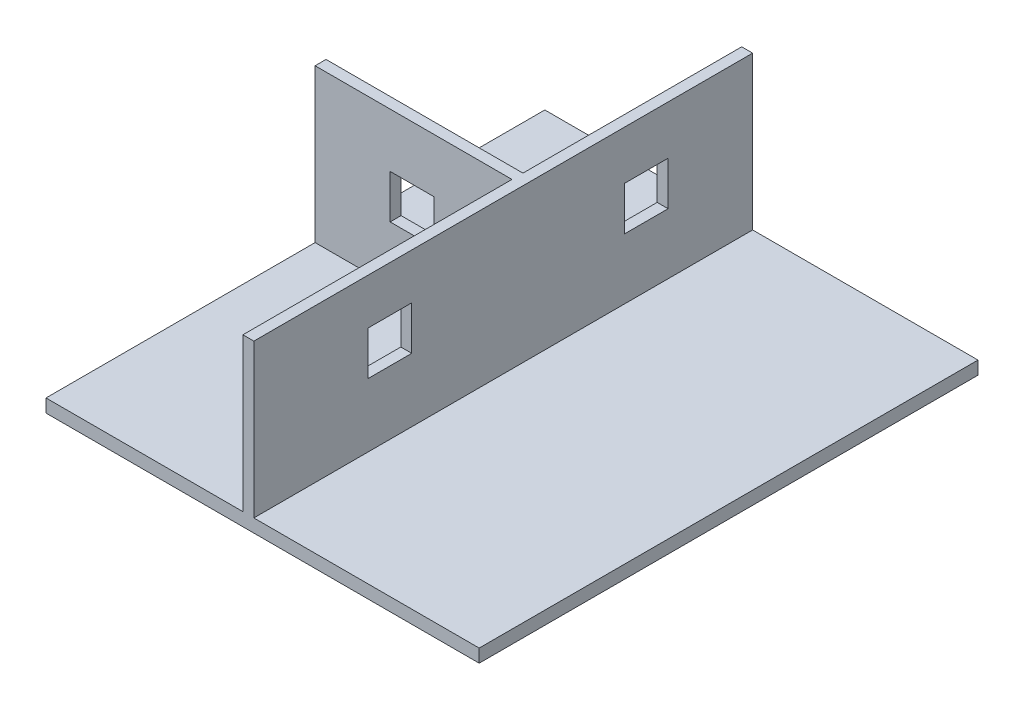
ISO-10303-21;
HEADER;
FILE_DESCRIPTION(('STEP AP214'),'2;1');
FILE_NAME('part.step','',(''),(''),'','','');
FILE_SCHEMA(('AUTOMOTIVE_DESIGN { 1 0 10303 214 1 1 1 1 }'));
ENDSEC;
DATA;
#1=APPLICATION_CONTEXT('core data for automotive mechanical design processes');
#2=APPLICATION_PROTOCOL_DEFINITION('international standard','automotive_design',2000,#1);
#3=PRODUCT_CONTEXT('',#1,'mechanical');
#4=PRODUCT('Part','Part','',(#3));
#5=PRODUCT_RELATED_PRODUCT_CATEGORY('part','',(#4));
#6=PRODUCT_DEFINITION_FORMATION('','',#4);
#7=PRODUCT_DEFINITION_CONTEXT('part definition',#1,'design');
#8=PRODUCT_DEFINITION('design','',#6,#7);
#9=PRODUCT_DEFINITION_SHAPE('','',#8);
#10=(LENGTH_UNIT() NAMED_UNIT(*) SI_UNIT(.MILLI.,.METRE.));
#11=(NAMED_UNIT(*) PLANE_ANGLE_UNIT() SI_UNIT($,.RADIAN.));
#12=(NAMED_UNIT(*) SI_UNIT($,.STERADIAN.) SOLID_ANGLE_UNIT());
#13=UNCERTAINTY_MEASURE_WITH_UNIT(LENGTH_MEASURE(1.E-05),#10,'distance_accuracy_value','');
#14=(GEOMETRIC_REPRESENTATION_CONTEXT(3) GLOBAL_UNCERTAINTY_ASSIGNED_CONTEXT((#13)) GLOBAL_UNIT_ASSIGNED_CONTEXT((#10,
#11,#12)) REPRESENTATION_CONTEXT('',''));
#15=CARTESIAN_POINT('',(0.,0.,0.));
#16=DIRECTION('',(0.,0.,1.));
#17=DIRECTION('',(1.,0.,0.));
#18=AXIS2_PLACEMENT_3D('',#15,#16,#17);
#19=CARTESIAN_POINT('',(0.,3.,0.));
#20=DIRECTION('',(0.,1.,0.));
#21=DIRECTION('',(0.,0.,1.));
#22=AXIS2_PLACEMENT_3D('',#19,#20,#21);
#23=PLANE('',#22);
#24=DIRECTION('',(0.,0.,-1.));
#25=VECTOR('',#24,1.);
#26=CARTESIAN_POINT('',(-2.00000000000002,3.,-57.));
#27=LINE('',#26,#25);
#28=CARTESIAN_POINT('',(-2.00000000000001,3.,57.));
#29=VERTEX_POINT('',#28);
#30=CARTESIAN_POINT('',(-2.00000000000001,3.,-57.));
#31=VERTEX_POINT('',#30);
#32=EDGE_CURVE('E297',#29,#31,#27,.T.);
#33=ORIENTED_EDGE('',*,*,#32,.F.);
#34=DIRECTION('',(1.,0.,0.));
#35=VECTOR('',#34,1.);
#36=CARTESIAN_POINT('',(-49.5,3.,57.));
#37=LINE('',#36,#35);
#38=CARTESIAN_POINT('',(49.5,3.,57.));
#39=VERTEX_POINT('',#38);
#40=EDGE_CURVE('E364',#29,#39,#37,.T.);
#41=ORIENTED_EDGE('',*,*,#40,.T.);
#42=DIRECTION('',(0.,0.,-1.));
#43=VECTOR('',#42,1.);
#44=CARTESIAN_POINT('',(49.5,3.,-57.));
#45=LINE('',#44,#43);
#46=CARTESIAN_POINT('',(49.5,3.,-57.));
#47=VERTEX_POINT('',#46);
#48=EDGE_CURVE('E354',#39,#47,#45,.T.);
#49=ORIENTED_EDGE('',*,*,#48,.T.);
#50=DIRECTION('',(-1.,0.,0.));
#51=VECTOR('',#50,1.);
#52=CARTESIAN_POINT('',(-49.5,3.,-57.));
#53=LINE('',#52,#51);
#54=EDGE_CURVE('E359',#47,#31,#53,.T.);
#55=ORIENTED_EDGE('',*,*,#54,.T.);
#56=EDGE_LOOP('',(#33,#41,#49,#55));
#57=FACE_BOUND('',#56,.T.);
#58=ADVANCED_FACE('F34',(#57),#23,.T.);
#59=DIRECTION('',(0.,0.,1.));
#60=VECTOR('',#59,1.);
#61=CARTESIAN_POINT('',(-4.50000000000001,3.,-4.50000000000001));
#62=LINE('',#61,#60);
#63=CARTESIAN_POINT('',(-4.50000000000001,3.,-4.50000000000001));
#64=VERTEX_POINT('',#63);
#65=CARTESIAN_POINT('',(-4.5,3.,57.));
#66=VERTEX_POINT('',#65);
#67=EDGE_CURVE('E302',#64,#66,#62,.T.);
#68=ORIENTED_EDGE('',*,*,#67,.F.);
#69=DIRECTION('',(1.,0.,0.));
#70=VECTOR('',#69,1.);
#71=CARTESIAN_POINT('',(-4.50000000000001,3.,-4.50000000000001));
#72=LINE('',#71,#70);
#73=CARTESIAN_POINT('',(-49.5,3.,-4.50000000000002));
#74=VERTEX_POINT('',#73);
#75=EDGE_CURVE('E325',#74,#64,#72,.T.);
#76=ORIENTED_EDGE('',*,*,#75,.F.);
#77=DIRECTION('',(0.,0.,1.));
#78=VECTOR('',#77,1.);
#79=CARTESIAN_POINT('',(-49.5,3.,-57.));
#80=LINE('',#79,#78);
#81=CARTESIAN_POINT('',(-49.5,3.,57.));
#82=VERTEX_POINT('',#81);
#83=EDGE_CURVE('E361',#74,#82,#80,.T.);
#84=ORIENTED_EDGE('',*,*,#83,.T.);
#85=EDGE_CURVE('E365',#82,#66,#37,.T.);
#86=ORIENTED_EDGE('',*,*,#85,.T.);
#87=EDGE_LOOP('',(#68,#76,#84,#86));
#88=FACE_BOUND('',#87,.T.);
#89=ADVANCED_FACE('F416',(#88),#23,.T.);
#90=CARTESIAN_POINT('',(49.5,3.,-57.));
#91=DIRECTION('',(-1.,0.,0.));
#92=DIRECTION('',(0.,0.,1.));
#93=AXIS2_PLACEMENT_3D('',#90,#91,#92);
#94=PLANE('',#93);
#95=DIRECTION('',(0.,0.,-1.));
#96=VECTOR('',#95,1.);
#97=CARTESIAN_POINT('',(49.5,0.,-57.));
#98=LINE('',#97,#96);
#99=CARTESIAN_POINT('',(49.5,0.,57.));
#100=VERTEX_POINT('',#99);
#101=CARTESIAN_POINT('',(49.5,0.,-57.));
#102=VERTEX_POINT('',#101);
#103=EDGE_CURVE('E353',#100,#102,#98,.T.);
#104=ORIENTED_EDGE('',*,*,#103,.T.);
#105=DIRECTION('',(0.,-1.,0.));
#106=VECTOR('',#105,1.);
#107=CARTESIAN_POINT('',(49.5,3.,-57.));
#108=LINE('',#107,#106);
#109=EDGE_CURVE('E11',#47,#102,#108,.T.);
#110=ORIENTED_EDGE('',*,*,#109,.F.);
#111=ORIENTED_EDGE('',*,*,#48,.F.);
#112=DIRECTION('',(0.,-1.,0.));
#113=VECTOR('',#112,1.);
#114=CARTESIAN_POINT('',(49.5,3.,57.));
#115=LINE('',#114,#113);
#116=EDGE_CURVE('E367',#39,#100,#115,.T.);
#117=ORIENTED_EDGE('',*,*,#116,.T.);
#118=EDGE_LOOP('',(#104,#110,#111,#117));
#119=FACE_BOUND('',#118,.T.);
#120=ADVANCED_FACE('F36',(#119),#94,.F.);
#121=CARTESIAN_POINT('',(-49.5,3.,-57.));
#122=DIRECTION('',(0.,0.,1.));
#123=DIRECTION('',(1.,0.,0.));
#124=AXIS2_PLACEMENT_3D('',#121,#122,#123);
#125=PLANE('',#124);
#126=DIRECTION('',(-1.,0.,0.));
#127=VECTOR('',#126,1.);
#128=CARTESIAN_POINT('',(-49.5,0.,-57.));
#129=LINE('',#128,#127);
#130=CARTESIAN_POINT('',(-49.5,0.,-57.));
#131=VERTEX_POINT('',#130);
#132=EDGE_CURVE('E370',#102,#131,#129,.T.);
#133=ORIENTED_EDGE('',*,*,#132,.T.);
#134=DIRECTION('',(0.,-1.,0.));
#135=VECTOR('',#134,1.);
#136=CARTESIAN_POINT('',(-49.5,3.,-57.));
#137=LINE('',#136,#135);
#138=CARTESIAN_POINT('',(-49.5,3.,-57.));
#139=VERTEX_POINT('',#138);
#140=EDGE_CURVE('E42',#139,#131,#137,.T.);
#141=ORIENTED_EDGE('',*,*,#140,.F.);
#142=CARTESIAN_POINT('',(-4.50000000000002,3.,-57.));
#143=VERTEX_POINT('',#142);
#144=EDGE_CURVE('E357',#143,#139,#53,.T.);
#145=ORIENTED_EDGE('',*,*,#144,.F.);
#146=DIRECTION('',(0.,-1.,0.));
#147=VECTOR('',#146,1.);
#148=CARTESIAN_POINT('',(-4.50000000000002,38.,-57.));
#149=LINE('',#148,#147);
#150=CARTESIAN_POINT('',(-4.50000000000002,38.,-57.));
#151=VERTEX_POINT('',#150);
#152=EDGE_CURVE('E347',#151,#143,#149,.T.);
#153=ORIENTED_EDGE('',*,*,#152,.F.);
#154=DIRECTION('',(-1.,0.,0.));
#155=VECTOR('',#154,1.);
#156=CARTESIAN_POINT('',(-2.00000000000002,38.,-57.));
#157=LINE('',#156,#155);
#158=CARTESIAN_POINT('',(-2.00000000000002,38.,-57.));
#159=VERTEX_POINT('',#158);
#160=EDGE_CURVE('E301',#159,#151,#157,.T.);
#161=ORIENTED_EDGE('',*,*,#160,.F.);
#162=DIRECTION('',(0.,-1.,0.));
#163=VECTOR('',#162,1.);
#164=CARTESIAN_POINT('',(-2.00000000000002,38.,-57.));
#165=LINE('',#164,#163);
#166=EDGE_CURVE('E350',#159,#31,#165,.T.);
#167=ORIENTED_EDGE('',*,*,#166,.T.);
#168=ORIENTED_EDGE('',*,*,#54,.F.);
#169=ORIENTED_EDGE('',*,*,#109,.T.);
#170=EDGE_LOOP('',(#133,#141,#145,#153,#161,#167,#168,#169));
#171=FACE_BOUND('',#170,.T.);
#172=ADVANCED_FACE('F431',(#171),#125,.F.);
#173=CARTESIAN_POINT('',(-49.5,3.,-57.));
#174=DIRECTION('',(1.,0.,0.));
#175=DIRECTION('',(0.,0.,-1.));
#176=AXIS2_PLACEMENT_3D('',#173,#174,#175);
#177=PLANE('',#176);
#178=DIRECTION('',(0.,0.,1.));
#179=VECTOR('',#178,1.);
#180=CARTESIAN_POINT('',(-49.5,0.,-57.));
#181=LINE('',#180,#179);
#182=CARTESIAN_POINT('',(-49.5,0.,57.));
#183=VERTEX_POINT('',#182);
#184=EDGE_CURVE('E372',#131,#183,#181,.T.);
#185=ORIENTED_EDGE('',*,*,#184,.T.);
#186=DIRECTION('',(0.,-1.,0.));
#187=VECTOR('',#186,1.);
#188=CARTESIAN_POINT('',(-49.5,3.,57.));
#189=LINE('',#188,#187);
#190=EDGE_CURVE('E377',#82,#183,#189,.T.);
#191=ORIENTED_EDGE('',*,*,#190,.F.);
#192=ORIENTED_EDGE('',*,*,#83,.F.);
#193=DIRECTION('',(0.,-1.,0.));
#194=VECTOR('',#193,1.);
#195=CARTESIAN_POINT('',(-49.5,38.,-4.5));
#196=LINE('',#195,#194);
#197=CARTESIAN_POINT('',(-49.5,38.,-4.5));
#198=VERTEX_POINT('',#197);
#199=EDGE_CURVE('E338',#198,#74,#196,.T.);
#200=ORIENTED_EDGE('',*,*,#199,.F.);
#201=DIRECTION('',(0.,0.,1.));
#202=VECTOR('',#201,1.);
#203=CARTESIAN_POINT('',(-49.5,38.,-7.));
#204=LINE('',#203,#202);
#205=CARTESIAN_POINT('',(-49.5,38.,-7.));
#206=VERTEX_POINT('',#205);
#207=EDGE_CURVE('E308',#206,#198,#204,.T.);
#208=ORIENTED_EDGE('',*,*,#207,.F.);
#209=DIRECTION('',(0.,-1.,0.));
#210=VECTOR('',#209,1.);
#211=CARTESIAN_POINT('',(-49.5,38.,-7.));
#212=LINE('',#211,#210);
#213=CARTESIAN_POINT('',(-49.5,3.,-7.00000000000002));
#214=VERTEX_POINT('',#213);
#215=EDGE_CURVE('E341',#206,#214,#212,.T.);
#216=ORIENTED_EDGE('',*,*,#215,.T.);
#217=EDGE_CURVE('E362',#139,#214,#80,.T.);
#218=ORIENTED_EDGE('',*,*,#217,.F.);
#219=ORIENTED_EDGE('',*,*,#140,.T.);
#220=EDGE_LOOP('',(#185,#191,#192,#200,#208,#216,#218,#219));
#221=FACE_BOUND('',#220,.T.);
#222=ADVANCED_FACE('F384',(#221),#177,.F.);
#223=CARTESIAN_POINT('',(-49.5,3.,57.));
#224=DIRECTION('',(0.,0.,-1.));
#225=DIRECTION('',(-1.,0.,0.));
#226=AXIS2_PLACEMENT_3D('',#223,#224,#225);
#227=PLANE('',#226);
#228=DIRECTION('',(1.,0.,0.));
#229=VECTOR('',#228,1.);
#230=CARTESIAN_POINT('',(-49.5,0.,57.));
#231=LINE('',#230,#229);
#232=EDGE_CURVE('E358',#183,#100,#231,.T.);
#233=ORIENTED_EDGE('',*,*,#232,.T.);
#234=ORIENTED_EDGE('',*,*,#116,.F.);
#235=ORIENTED_EDGE('',*,*,#40,.F.);
#236=DIRECTION('',(0.,-1.,0.));
#237=VECTOR('',#236,1.);
#238=CARTESIAN_POINT('',(-2.,38.,57.));
#239=LINE('',#238,#237);
#240=CARTESIAN_POINT('',(-2.,38.,57.));
#241=VERTEX_POINT('',#240);
#242=EDGE_CURVE('E316',#241,#29,#239,.T.);
#243=ORIENTED_EDGE('',*,*,#242,.F.);
#244=DIRECTION('',(1.,0.,0.));
#245=VECTOR('',#244,1.);
#246=CARTESIAN_POINT('',(-2.,38.,57.));
#247=LINE('',#246,#245);
#248=CARTESIAN_POINT('',(-4.5,38.,57.));
#249=VERTEX_POINT('',#248);
#250=EDGE_CURVE('E314',#249,#241,#247,.T.);
#251=ORIENTED_EDGE('',*,*,#250,.F.);
#252=DIRECTION('',(0.,-1.,0.));
#253=VECTOR('',#252,1.);
#254=CARTESIAN_POINT('',(-4.5,38.,57.));
#255=LINE('',#254,#253);
#256=EDGE_CURVE('E332',#249,#66,#255,.T.);
#257=ORIENTED_EDGE('',*,*,#256,.T.);
#258=ORIENTED_EDGE('',*,*,#85,.F.);
#259=ORIENTED_EDGE('',*,*,#190,.T.);
#260=EDGE_LOOP('',(#233,#234,#235,#243,#251,#257,#258,#259));
#261=FACE_BOUND('',#260,.T.);
#262=ADVANCED_FACE('F394',(#261),#227,.F.);
#263=DIRECTION('',(-1.,0.,0.));
#264=VECTOR('',#263,1.);
#265=CARTESIAN_POINT('',(-4.50000000000001,3.,-7.00000000000001));
#266=LINE('',#265,#264);
#267=CARTESIAN_POINT('',(-4.50000000000001,3.,-7.00000000000001));
#268=VERTEX_POINT('',#267);
#269=EDGE_CURVE('E322',#268,#214,#266,.T.);
#270=ORIENTED_EDGE('',*,*,#269,.F.);
#271=DIRECTION('',(0.,0.,1.));
#272=VECTOR('',#271,1.);
#273=CARTESIAN_POINT('',(-4.50000000000002,3.,-57.));
#274=LINE('',#273,#272);
#275=EDGE_CURVE('E319',#143,#268,#274,.T.);
#276=ORIENTED_EDGE('',*,*,#275,.F.);
#277=ORIENTED_EDGE('',*,*,#144,.T.);
#278=ORIENTED_EDGE('',*,*,#217,.T.);
#279=EDGE_LOOP('',(#270,#276,#277,#278));
#280=FACE_BOUND('',#279,.T.);
#281=ADVANCED_FACE('F430',(#280),#23,.T.);
#282=CARTESIAN_POINT('',(0.,0.,0.));
#283=DIRECTION('',(0.,1.,0.));
#284=DIRECTION('',(0.,0.,1.));
#285=AXIS2_PLACEMENT_3D('',#282,#283,#284);
#286=PLANE('',#285);
#287=ORIENTED_EDGE('',*,*,#103,.F.);
#288=ORIENTED_EDGE('',*,*,#232,.F.);
#289=ORIENTED_EDGE('',*,*,#184,.F.);
#290=ORIENTED_EDGE('',*,*,#132,.F.);
#291=EDGE_LOOP('',(#287,#288,#289,#290));
#292=FACE_BOUND('',#291,.T.);
#293=ADVANCED_FACE('F391',(#292),#286,.F.);
#294=CARTESIAN_POINT('',(-2.00000000000002,38.,-57.));
#295=DIRECTION('',(-1.,0.,0.));
#296=DIRECTION('',(0.,0.,1.));
#297=AXIS2_PLACEMENT_3D('',#294,#295,#296);
#298=PLANE('',#297);
#299=DIRECTION('',(0.,0.,1.));
#300=VECTOR('',#299,1.);
#301=CARTESIAN_POINT('',(-2.00000000000002,16.8632694530573,-57.));
#302=LINE('',#301,#300);
#303=CARTESIAN_POINT('',(-2.00000000000001,16.8632694530573,-37.6785062458383));
#304=VERTEX_POINT('',#303);
#305=CARTESIAN_POINT('',(-2.00000000000001,16.8632694530573,-27.6785062458383));
#306=VERTEX_POINT('',#305);
#307=EDGE_CURVE('E259',#304,#306,#302,.T.);
#308=ORIENTED_EDGE('',*,*,#307,.T.);
#309=DIRECTION('',(0.,1.,0.));
#310=VECTOR('',#309,1.);
#311=CARTESIAN_POINT('',(-2.00000000000001,38.,-27.6785062458383));
#312=LINE('',#311,#310);
#313=CARTESIAN_POINT('',(-2.00000000000001,26.8632694530573,-27.6785062458383));
#314=VERTEX_POINT('',#313);
#315=EDGE_CURVE('E262',#306,#314,#312,.T.);
#316=ORIENTED_EDGE('',*,*,#315,.T.);
#317=DIRECTION('',(0.,0.,-1.));
#318=VECTOR('',#317,1.);
#319=CARTESIAN_POINT('',(-2.00000000000002,26.8632694530573,-57.));
#320=LINE('',#319,#318);
#321=CARTESIAN_POINT('',(-2.00000000000001,26.8632694530573,-37.6785062458383));
#322=VERTEX_POINT('',#321);
#323=EDGE_CURVE('E256',#314,#322,#320,.T.);
#324=ORIENTED_EDGE('',*,*,#323,.T.);
#325=DIRECTION('',(0.,-1.,0.));
#326=VECTOR('',#325,1.);
#327=CARTESIAN_POINT('',(-2.00000000000001,38.,-37.6785062458383));
#328=LINE('',#327,#326);
#329=EDGE_CURVE('E200',#322,#304,#328,.T.);
#330=ORIENTED_EDGE('',*,*,#329,.T.);
#331=EDGE_LOOP('',(#308,#316,#324,#330));
#332=FACE_BOUND('',#331,.T.);
#333=DIRECTION('',(0.,0.,1.));
#334=VECTOR('',#333,1.);
#335=CARTESIAN_POINT('',(-2.00000000000002,17.5373572475975,-57.));
#336=LINE('',#335,#334);
#337=CARTESIAN_POINT('',(-2.00000000000001,17.5373572475975,20.9129561027299));
#338=VERTEX_POINT('',#337);
#339=CARTESIAN_POINT('',(-2.00000000000001,17.5373572475975,30.9129561027299));
#340=VERTEX_POINT('',#339);
#341=EDGE_CURVE('E250',#338,#340,#336,.T.);
#342=ORIENTED_EDGE('',*,*,#341,.T.);
#343=DIRECTION('',(0.,1.,0.));
#344=VECTOR('',#343,1.);
#345=CARTESIAN_POINT('',(-2.00000000000001,38.0000000000001,30.9129561027299));
#346=LINE('',#345,#344);
#347=CARTESIAN_POINT('',(-2.00000000000001,27.5373572475975,30.9129561027299));
#348=VERTEX_POINT('',#347);
#349=EDGE_CURVE('E253',#340,#348,#346,.T.);
#350=ORIENTED_EDGE('',*,*,#349,.T.);
#351=DIRECTION('',(0.,0.,-1.));
#352=VECTOR('',#351,1.);
#353=CARTESIAN_POINT('',(-2.00000000000002,27.5373572475975,-57.));
#354=LINE('',#353,#352);
#355=CARTESIAN_POINT('',(-2.00000000000001,27.5373572475975,20.9129561027299));
#356=VERTEX_POINT('',#355);
#357=EDGE_CURVE('E224',#348,#356,#354,.T.);
#358=ORIENTED_EDGE('',*,*,#357,.T.);
#359=DIRECTION('',(0.,-1.,0.));
#360=VECTOR('',#359,1.);
#361=CARTESIAN_POINT('',(-2.00000000000001,38.,20.9129561027299));
#362=LINE('',#361,#360);
#363=EDGE_CURVE('E247',#356,#338,#362,.T.);
#364=ORIENTED_EDGE('',*,*,#363,.T.);
#365=EDGE_LOOP('',(#342,#350,#358,#364));
#366=FACE_BOUND('',#365,.T.);
#367=ORIENTED_EDGE('',*,*,#32,.T.);
#368=ORIENTED_EDGE('',*,*,#166,.F.);
#369=DIRECTION('',(0.,0.,-1.));
#370=VECTOR('',#369,1.);
#371=CARTESIAN_POINT('',(-2.00000000000002,38.,-57.));
#372=LINE('',#371,#370);
#373=EDGE_CURVE('E298',#241,#159,#372,.T.);
#374=ORIENTED_EDGE('',*,*,#373,.F.);
#375=ORIENTED_EDGE('',*,*,#242,.T.);
#376=EDGE_LOOP('',(#367,#368,#374,#375));
#377=FACE_BOUND('',#376,.T.);
#378=ADVANCED_FACE('F405',(#332,#366,#377),#298,.F.);
#379=CARTESIAN_POINT('',(-4.50000000000002,38.,-57.));
#380=DIRECTION('',(1.,0.,0.));
#381=DIRECTION('',(0.,0.,-1.));
#382=AXIS2_PLACEMENT_3D('',#379,#380,#381);
#383=PLANE('',#382);
#384=DIRECTION('',(0.,0.,-1.));
#385=VECTOR('',#384,1.);
#386=CARTESIAN_POINT('',(-4.50000000000002,26.8632694530573,-37.6785062458383));
#387=LINE('',#386,#385);
#388=CARTESIAN_POINT('',(-4.50000000000001,26.8632694530573,-27.6785062458383));
#389=VERTEX_POINT('',#388);
#390=CARTESIAN_POINT('',(-4.50000000000002,26.8632694530573,-37.6785062458383));
#391=VERTEX_POINT('',#390);
#392=EDGE_CURVE('E207',#389,#391,#387,.T.);
#393=ORIENTED_EDGE('',*,*,#392,.F.);
#394=DIRECTION('',(0.,1.,0.));
#395=VECTOR('',#394,1.);
#396=CARTESIAN_POINT('',(-4.50000000000001,26.8632694530573,-27.6785062458383));
#397=LINE('',#396,#395);
#398=CARTESIAN_POINT('',(-4.50000000000001,16.8632694530573,-27.6785062458383));
#399=VERTEX_POINT('',#398);
#400=EDGE_CURVE('E212',#399,#389,#397,.T.);
#401=ORIENTED_EDGE('',*,*,#400,.F.);
#402=DIRECTION('',(0.,0.,1.));
#403=VECTOR('',#402,1.);
#404=CARTESIAN_POINT('',(-4.50000000000002,16.8632694530573,-37.6785062458383));
#405=LINE('',#404,#403);
#406=CARTESIAN_POINT('',(-4.50000000000002,16.8632694530573,-37.6785062458383));
#407=VERTEX_POINT('',#406);
#408=EDGE_CURVE('E217',#407,#399,#405,.T.);
#409=ORIENTED_EDGE('',*,*,#408,.F.);
#410=DIRECTION('',(0.,-1.,0.));
#411=VECTOR('',#410,1.);
#412=CARTESIAN_POINT('',(-4.50000000000002,26.8632694530573,-37.6785062458383));
#413=LINE('',#412,#411);
#414=EDGE_CURVE('E197',#391,#407,#413,.T.);
#415=ORIENTED_EDGE('',*,*,#414,.F.);
#416=EDGE_LOOP('',(#393,#401,#409,#415));
#417=FACE_BOUND('',#416,.T.);
#418=ORIENTED_EDGE('',*,*,#275,.T.);
#419=DIRECTION('',(0.,-1.,0.));
#420=VECTOR('',#419,1.);
#421=CARTESIAN_POINT('',(-4.50000000000001,38.,-7.00000000000001));
#422=LINE('',#421,#420);
#423=CARTESIAN_POINT('',(-4.50000000000001,38.,-7.00000000000001));
#424=VERTEX_POINT('',#423);
#425=EDGE_CURVE('E344',#424,#268,#422,.T.);
#426=ORIENTED_EDGE('',*,*,#425,.F.);
#427=DIRECTION('',(0.,0.,1.));
#428=VECTOR('',#427,1.);
#429=CARTESIAN_POINT('',(-4.50000000000002,38.,-57.));
#430=LINE('',#429,#428);
#431=EDGE_CURVE('E304',#151,#424,#430,.T.);
#432=ORIENTED_EDGE('',*,*,#431,.F.);
#433=ORIENTED_EDGE('',*,*,#152,.T.);
#434=EDGE_LOOP('',(#418,#426,#432,#433));
#435=FACE_BOUND('',#434,.T.);
#436=ADVANCED_FACE('F214',(#417,#435),#383,.F.);
#437=CARTESIAN_POINT('',(-4.50000000000001,38.,-7.00000000000001));
#438=DIRECTION('',(0.,0.,1.));
#439=DIRECTION('',(1.,0.,0.));
#440=AXIS2_PLACEMENT_3D('',#437,#438,#439);
#441=PLANE('',#440);
#442=DIRECTION('',(1.,0.,0.));
#443=VECTOR('',#442,1.);
#444=CARTESIAN_POINT('',(-4.50000000000001,15.6633425647071,-7.00000000000001));
#445=LINE('',#444,#443);
#446=CARTESIAN_POINT('',(-32.3520896562246,15.6633425647071,-7.00000000000001));
#447=VERTEX_POINT('',#446);
#448=CARTESIAN_POINT('',(-22.3520896562246,15.6633425647071,-7.00000000000001));
#449=VERTEX_POINT('',#448);
#450=EDGE_CURVE('E291',#447,#449,#445,.T.);
#451=ORIENTED_EDGE('',*,*,#450,.T.);
#452=DIRECTION('',(0.,1.,0.));
#453=VECTOR('',#452,1.);
#454=CARTESIAN_POINT('',(-22.3520896562246,38.,-7.));
#455=LINE('',#454,#453);
#456=CARTESIAN_POINT('',(-22.3520896562246,25.6633425647071,-7.00000000000001));
#457=VERTEX_POINT('',#456);
#458=EDGE_CURVE('E294',#449,#457,#455,.T.);
#459=ORIENTED_EDGE('',*,*,#458,.T.);
#460=DIRECTION('',(-1.,0.,0.));
#461=VECTOR('',#460,1.);
#462=CARTESIAN_POINT('',(-4.50000000000001,25.6633425647071,-7.00000000000001));
#463=LINE('',#462,#461);
#464=CARTESIAN_POINT('',(-32.3520896562246,25.6633425647071,-7.));
#465=VERTEX_POINT('',#464);
#466=EDGE_CURVE('E279',#457,#465,#463,.T.);
#467=ORIENTED_EDGE('',*,*,#466,.T.);
#468=DIRECTION('',(0.,-1.,0.));
#469=VECTOR('',#468,1.);
#470=CARTESIAN_POINT('',(-32.3520896562246,38.,-7.));
#471=LINE('',#470,#469);
#472=EDGE_CURVE('E288',#465,#447,#471,.T.);
#473=ORIENTED_EDGE('',*,*,#472,.T.);
#474=EDGE_LOOP('',(#451,#459,#467,#473));
#475=FACE_BOUND('',#474,.T.);
#476=ORIENTED_EDGE('',*,*,#269,.T.);
#477=ORIENTED_EDGE('',*,*,#215,.F.);
#478=DIRECTION('',(-1.,0.,0.));
#479=VECTOR('',#478,1.);
#480=CARTESIAN_POINT('',(-4.50000000000001,38.,-7.00000000000001));
#481=LINE('',#480,#479);
#482=EDGE_CURVE('E306',#424,#206,#481,.T.);
#483=ORIENTED_EDGE('',*,*,#482,.F.);
#484=ORIENTED_EDGE('',*,*,#425,.T.);
#485=EDGE_LOOP('',(#476,#477,#483,#484));
#486=FACE_BOUND('',#485,.T.);
#487=ADVANCED_FACE('F428',(#475,#486),#441,.F.);
#488=CARTESIAN_POINT('',(-4.50000000000001,38.,-4.50000000000001));
#489=DIRECTION('',(0.,0.,-1.));
#490=DIRECTION('',(-1.,0.,0.));
#491=AXIS2_PLACEMENT_3D('',#488,#489,#490);
#492=PLANE('',#491);
#493=DIRECTION('',(-1.,0.,0.));
#494=VECTOR('',#493,1.);
#495=CARTESIAN_POINT('',(-32.3520896562246,25.6633425647071,-4.50000000000001));
#496=LINE('',#495,#494);
#497=CARTESIAN_POINT('',(-22.3520896562246,25.6633425647071,-4.5));
#498=VERTEX_POINT('',#497);
#499=CARTESIAN_POINT('',(-32.3520896562246,25.6633425647071,-4.50000000000001));
#500=VERTEX_POINT('',#499);
#501=EDGE_CURVE('E267',#498,#500,#496,.T.);
#502=ORIENTED_EDGE('',*,*,#501,.F.);
#503=DIRECTION('',(0.,1.,0.));
#504=VECTOR('',#503,1.);
#505=CARTESIAN_POINT('',(-22.3520896562246,25.6633425647071,-4.50000000000001));
#506=LINE('',#505,#504);
#507=CARTESIAN_POINT('',(-22.3520896562246,15.6633425647071,-4.50000000000001));
#508=VERTEX_POINT('',#507);
#509=EDGE_CURVE('E265',#508,#498,#506,.T.);
#510=ORIENTED_EDGE('',*,*,#509,.F.);
#511=DIRECTION('',(1.,0.,0.));
#512=VECTOR('',#511,1.);
#513=CARTESIAN_POINT('',(-32.3520896562246,15.6633425647071,-4.50000000000001));
#514=LINE('',#513,#512);
#515=CARTESIAN_POINT('',(-32.3520896562246,15.6633425647071,-4.50000000000001));
#516=VERTEX_POINT('',#515);
#517=EDGE_CURVE('E273',#516,#508,#514,.T.);
#518=ORIENTED_EDGE('',*,*,#517,.F.);
#519=DIRECTION('',(0.,-1.,0.));
#520=VECTOR('',#519,1.);
#521=CARTESIAN_POINT('',(-32.3520896562246,25.6633425647071,-4.50000000000001));
#522=LINE('',#521,#520);
#523=EDGE_CURVE('E270',#500,#516,#522,.T.);
#524=ORIENTED_EDGE('',*,*,#523,.F.);
#525=EDGE_LOOP('',(#502,#510,#518,#524));
#526=FACE_BOUND('',#525,.T.);
#527=ORIENTED_EDGE('',*,*,#75,.T.);
#528=DIRECTION('',(0.,-1.,0.));
#529=VECTOR('',#528,1.);
#530=CARTESIAN_POINT('',(-4.50000000000001,38.,-4.50000000000001));
#531=LINE('',#530,#529);
#532=CARTESIAN_POINT('',(-4.50000000000001,38.,-4.50000000000001));
#533=VERTEX_POINT('',#532);
#534=EDGE_CURVE('E335',#533,#64,#531,.T.);
#535=ORIENTED_EDGE('',*,*,#534,.F.);
#536=DIRECTION('',(1.,0.,0.));
#537=VECTOR('',#536,1.);
#538=CARTESIAN_POINT('',(-4.50000000000001,38.,-4.50000000000001));
#539=LINE('',#538,#537);
#540=EDGE_CURVE('E310',#198,#533,#539,.T.);
#541=ORIENTED_EDGE('',*,*,#540,.F.);
#542=ORIENTED_EDGE('',*,*,#199,.T.);
#543=EDGE_LOOP('',(#527,#535,#541,#542));
#544=FACE_BOUND('',#543,.T.);
#545=ADVANCED_FACE('F419',(#526,#544),#492,.F.);
#546=CARTESIAN_POINT('',(-4.50000000000001,38.,-4.50000000000001));
#547=DIRECTION('',(1.,0.,0.));
#548=DIRECTION('',(0.,0.,-1.));
#549=AXIS2_PLACEMENT_3D('',#546,#547,#548);
#550=PLANE('',#549);
#551=DIRECTION('',(0.,0.,-1.));
#552=VECTOR('',#551,1.);
#553=CARTESIAN_POINT('',(-4.50000000000001,27.5373572475975,20.9129561027299));
#554=LINE('',#553,#552);
#555=CARTESIAN_POINT('',(-4.50000000000001,27.5373572475975,30.9129561027299));
#556=VERTEX_POINT('',#555);
#557=CARTESIAN_POINT('',(-4.50000000000001,27.5373572475975,20.9129561027299));
#558=VERTEX_POINT('',#557);
#559=EDGE_CURVE('E229',#556,#558,#554,.T.);
#560=ORIENTED_EDGE('',*,*,#559,.F.);
#561=DIRECTION('',(0.,1.,0.));
#562=VECTOR('',#561,1.);
#563=CARTESIAN_POINT('',(-4.50000000000001,27.5373572475975,30.9129561027299));
#564=LINE('',#563,#562);
#565=CARTESIAN_POINT('',(-4.50000000000001,17.5373572475975,30.9129561027299));
#566=VERTEX_POINT('',#565);
#567=EDGE_CURVE('E227',#566,#556,#564,.T.);
#568=ORIENTED_EDGE('',*,*,#567,.F.);
#569=DIRECTION('',(0.,0.,1.));
#570=VECTOR('',#569,1.);
#571=CARTESIAN_POINT('',(-4.50000000000001,17.5373572475975,20.9129561027299));
#572=LINE('',#571,#570);
#573=CARTESIAN_POINT('',(-4.50000000000001,17.5373572475975,20.9129561027299));
#574=VERTEX_POINT('',#573);
#575=EDGE_CURVE('E234',#574,#566,#572,.T.);
#576=ORIENTED_EDGE('',*,*,#575,.F.);
#577=DIRECTION('',(0.,-1.,0.));
#578=VECTOR('',#577,1.);
#579=CARTESIAN_POINT('',(-4.50000000000001,27.5373572475975,20.9129561027299));
#580=LINE('',#579,#578);
#581=EDGE_CURVE('E231',#558,#574,#580,.T.);
#582=ORIENTED_EDGE('',*,*,#581,.F.);
#583=EDGE_LOOP('',(#560,#568,#576,#582));
#584=FACE_BOUND('',#583,.T.);
#585=ORIENTED_EDGE('',*,*,#67,.T.);
#586=ORIENTED_EDGE('',*,*,#256,.F.);
#587=DIRECTION('',(0.,0.,1.));
#588=VECTOR('',#587,1.);
#589=CARTESIAN_POINT('',(-4.50000000000001,38.,-4.50000000000001));
#590=LINE('',#589,#588);
#591=EDGE_CURVE('E312',#533,#249,#590,.T.);
#592=ORIENTED_EDGE('',*,*,#591,.F.);
#593=ORIENTED_EDGE('',*,*,#534,.T.);
#594=EDGE_LOOP('',(#585,#586,#592,#593));
#595=FACE_BOUND('',#594,.T.);
#596=ADVANCED_FACE('F413',(#584,#595),#550,.F.);
#597=CARTESIAN_POINT('',(0.,38.,0.));
#598=DIRECTION('',(0.,-1.,0.));
#599=DIRECTION('',(0.,0.,-1.));
#600=AXIS2_PLACEMENT_3D('',#597,#598,#599);
#601=PLANE('',#600);
#602=ORIENTED_EDGE('',*,*,#373,.T.);
#603=ORIENTED_EDGE('',*,*,#160,.T.);
#604=ORIENTED_EDGE('',*,*,#431,.T.);
#605=ORIENTED_EDGE('',*,*,#482,.T.);
#606=ORIENTED_EDGE('',*,*,#207,.T.);
#607=ORIENTED_EDGE('',*,*,#540,.T.);
#608=ORIENTED_EDGE('',*,*,#591,.T.);
#609=ORIENTED_EDGE('',*,*,#250,.T.);
#610=EDGE_LOOP('',(#602,#603,#604,#605,#606,#607,#608,#609));
#611=FACE_BOUND('',#610,.T.);
#612=ADVANCED_FACE('F408',(#611),#601,.F.);
#613=CARTESIAN_POINT('',(-22.3520896562246,25.6633425647071,-39.5));
#614=DIRECTION('',(1.,0.,0.));
#615=DIRECTION('',(0.,0.,-1.));
#616=AXIS2_PLACEMENT_3D('',#613,#614,#615);
#617=PLANE('',#616);
#618=DIRECTION('',(0.,0.,1.));
#619=VECTOR('',#618,1.);
#620=CARTESIAN_POINT('',(-22.3520896562246,15.6633425647071,-39.5));
#621=LINE('',#620,#619);
#622=EDGE_CURVE('E277',#449,#508,#621,.T.);
#623=ORIENTED_EDGE('',*,*,#622,.T.);
#624=ORIENTED_EDGE('',*,*,#509,.T.);
#625=DIRECTION('',(0.,0.,1.));
#626=VECTOR('',#625,1.);
#627=CARTESIAN_POINT('',(-22.3520896562246,25.6633425647071,-39.5));
#628=LINE('',#627,#626);
#629=EDGE_CURVE('E276',#457,#498,#628,.T.);
#630=ORIENTED_EDGE('',*,*,#629,.F.);
#631=ORIENTED_EDGE('',*,*,#458,.F.);
#632=EDGE_LOOP('',(#623,#624,#630,#631));
#633=FACE_BOUND('',#632,.T.);
#634=ADVANCED_FACE('F509',(#633),#617,.F.);
#635=CARTESIAN_POINT('',(-32.3520896562246,15.6633425647071,-39.5));
#636=DIRECTION('',(0.,-1.,0.));
#637=DIRECTION('',(0.,0.,-1.));
#638=AXIS2_PLACEMENT_3D('',#635,#636,#637);
#639=PLANE('',#638);
#640=DIRECTION('',(0.,0.,1.));
#641=VECTOR('',#640,1.);
#642=CARTESIAN_POINT('',(-32.3520896562246,15.6633425647071,-39.5));
#643=LINE('',#642,#641);
#644=EDGE_CURVE('E280',#447,#516,#643,.T.);
#645=ORIENTED_EDGE('',*,*,#644,.T.);
#646=ORIENTED_EDGE('',*,*,#517,.T.);
#647=ORIENTED_EDGE('',*,*,#622,.F.);
#648=ORIENTED_EDGE('',*,*,#450,.F.);
#649=EDGE_LOOP('',(#645,#646,#647,#648));
#650=FACE_BOUND('',#649,.T.);
#651=ADVANCED_FACE('F540',(#650),#639,.F.);
#652=CARTESIAN_POINT('',(-32.3520896562246,25.6633425647071,-39.5));
#653=DIRECTION('',(-1.,0.,0.));
#654=DIRECTION('',(0.,0.,1.));
#655=AXIS2_PLACEMENT_3D('',#652,#653,#654);
#656=PLANE('',#655);
#657=DIRECTION('',(0.,0.,1.));
#658=VECTOR('',#657,1.);
#659=CARTESIAN_POINT('',(-32.3520896562246,25.6633425647071,-39.5));
#660=LINE('',#659,#658);
#661=EDGE_CURVE('E282',#465,#500,#660,.T.);
#662=ORIENTED_EDGE('',*,*,#661,.T.);
#663=ORIENTED_EDGE('',*,*,#523,.T.);
#664=ORIENTED_EDGE('',*,*,#644,.F.);
#665=ORIENTED_EDGE('',*,*,#472,.F.);
#666=EDGE_LOOP('',(#662,#663,#664,#665));
#667=FACE_BOUND('',#666,.T.);
#668=ADVANCED_FACE('F550',(#667),#656,.F.);
#669=CARTESIAN_POINT('',(-32.3520896562246,25.6633425647071,-39.5));
#670=DIRECTION('',(0.,1.,0.));
#671=DIRECTION('',(0.,0.,1.));
#672=AXIS2_PLACEMENT_3D('',#669,#670,#671);
#673=PLANE('',#672);
#674=ORIENTED_EDGE('',*,*,#629,.T.);
#675=ORIENTED_EDGE('',*,*,#501,.T.);
#676=ORIENTED_EDGE('',*,*,#661,.F.);
#677=ORIENTED_EDGE('',*,*,#466,.F.);
#678=EDGE_LOOP('',(#674,#675,#676,#677));
#679=FACE_BOUND('',#678,.T.);
#680=ADVANCED_FACE('F560',(#679),#673,.F.);
#681=CARTESIAN_POINT('',(30.5,27.5373572475975,30.9129561027299));
#682=DIRECTION('',(0.,0.,1.));
#683=DIRECTION('',(0.,-1.,0.));
#684=AXIS2_PLACEMENT_3D('',#681,#682,#683);
#685=PLANE('',#684);
#686=DIRECTION('',(-1.,0.,0.));
#687=VECTOR('',#686,1.);
#688=CARTESIAN_POINT('',(30.5,17.5373572475975,30.9129561027299));
#689=LINE('',#688,#687);
#690=EDGE_CURVE('E238',#340,#566,#689,.T.);
#691=ORIENTED_EDGE('',*,*,#690,.T.);
#692=ORIENTED_EDGE('',*,*,#567,.T.);
#693=DIRECTION('',(-1.,0.,0.));
#694=VECTOR('',#693,1.);
#695=CARTESIAN_POINT('',(30.5,27.5373572475975,30.9129561027299));
#696=LINE('',#695,#694);
#697=EDGE_CURVE('E237',#348,#556,#696,.T.);
#698=ORIENTED_EDGE('',*,*,#697,.F.);
#699=ORIENTED_EDGE('',*,*,#349,.F.);
#700=EDGE_LOOP('',(#691,#692,#698,#699));
#701=FACE_BOUND('',#700,.T.);
#702=ADVANCED_FACE('F570',(#701),#685,.F.);
#703=CARTESIAN_POINT('',(30.5,17.5373572475975,20.9129561027299));
#704=DIRECTION('',(0.,-1.,0.));
#705=DIRECTION('',(0.,0.,-1.));
#706=AXIS2_PLACEMENT_3D('',#703,#704,#705);
#707=PLANE('',#706);
#708=DIRECTION('',(-1.,0.,0.));
#709=VECTOR('',#708,1.);
#710=CARTESIAN_POINT('',(30.5,17.5373572475975,20.9129561027299));
#711=LINE('',#710,#709);
#712=EDGE_CURVE('E240',#338,#574,#711,.T.);
#713=ORIENTED_EDGE('',*,*,#712,.T.);
#714=ORIENTED_EDGE('',*,*,#575,.T.);
#715=ORIENTED_EDGE('',*,*,#690,.F.);
#716=ORIENTED_EDGE('',*,*,#341,.F.);
#717=EDGE_LOOP('',(#713,#714,#715,#716));
#718=FACE_BOUND('',#717,.T.);
#719=ADVANCED_FACE('F599',(#718),#707,.F.);
#720=CARTESIAN_POINT('',(30.5,27.5373572475975,20.9129561027299));
#721=DIRECTION('',(0.,0.,-1.));
#722=DIRECTION('',(-1.,0.,0.));
#723=AXIS2_PLACEMENT_3D('',#720,#721,#722);
#724=PLANE('',#723);
#725=DIRECTION('',(-1.,0.,0.));
#726=VECTOR('',#725,1.);
#727=CARTESIAN_POINT('',(30.5,27.5373572475975,20.9129561027299));
#728=LINE('',#727,#726);
#729=EDGE_CURVE('E57',#356,#558,#728,.T.);
#730=ORIENTED_EDGE('',*,*,#729,.T.);
#731=ORIENTED_EDGE('',*,*,#581,.T.);
#732=ORIENTED_EDGE('',*,*,#712,.F.);
#733=ORIENTED_EDGE('',*,*,#363,.F.);
#734=EDGE_LOOP('',(#730,#731,#732,#733));
#735=FACE_BOUND('',#734,.T.);
#736=ADVANCED_FACE('F609',(#735),#724,.F.);
#737=CARTESIAN_POINT('',(30.5,27.5373572475975,20.9129561027299));
#738=DIRECTION('',(0.,1.,0.));
#739=DIRECTION('',(0.,0.,1.));
#740=AXIS2_PLACEMENT_3D('',#737,#738,#739);
#741=PLANE('',#740);
#742=ORIENTED_EDGE('',*,*,#697,.T.);
#743=ORIENTED_EDGE('',*,*,#559,.T.);
#744=ORIENTED_EDGE('',*,*,#729,.F.);
#745=ORIENTED_EDGE('',*,*,#357,.F.);
#746=EDGE_LOOP('',(#742,#743,#744,#745));
#747=FACE_BOUND('',#746,.T.);
#748=ADVANCED_FACE('F619',(#747),#741,.F.);
#749=CARTESIAN_POINT('',(30.5,26.8632694530573,-27.6785062458383));
#750=DIRECTION('',(0.,0.,1.));
#751=DIRECTION('',(1.,0.,0.));
#752=AXIS2_PLACEMENT_3D('',#749,#750,#751);
#753=PLANE('',#752);
#754=DIRECTION('',(-1.,0.,0.));
#755=VECTOR('',#754,1.);
#756=CARTESIAN_POINT('',(30.5,16.8632694530573,-27.6785062458383));
#757=LINE('',#756,#755);
#758=EDGE_CURVE('E222',#306,#399,#757,.T.);
#759=ORIENTED_EDGE('',*,*,#758,.T.);
#760=ORIENTED_EDGE('',*,*,#400,.T.);
#761=DIRECTION('',(-1.,0.,0.));
#762=VECTOR('',#761,1.);
#763=CARTESIAN_POINT('',(30.5,26.8632694530573,-27.6785062458383));
#764=LINE('',#763,#762);
#765=EDGE_CURVE('E203',#314,#389,#764,.T.);
#766=ORIENTED_EDGE('',*,*,#765,.F.);
#767=ORIENTED_EDGE('',*,*,#315,.F.);
#768=EDGE_LOOP('',(#759,#760,#766,#767));
#769=FACE_BOUND('',#768,.T.);
#770=ADVANCED_FACE('F629',(#769),#753,.F.);
#771=CARTESIAN_POINT('',(30.5,16.8632694530573,-37.6785062458383));
#772=DIRECTION('',(0.,-1.,0.));
#773=DIRECTION('',(0.,0.,-1.));
#774=AXIS2_PLACEMENT_3D('',#771,#772,#773);
#775=PLANE('',#774);
#776=DIRECTION('',(-1.,0.,0.));
#777=VECTOR('',#776,1.);
#778=CARTESIAN_POINT('',(30.5,16.8632694530573,-37.6785062458383));
#779=LINE('',#778,#777);
#780=EDGE_CURVE('E202',#304,#407,#779,.T.);
#781=ORIENTED_EDGE('',*,*,#780,.T.);
#782=ORIENTED_EDGE('',*,*,#408,.T.);
#783=ORIENTED_EDGE('',*,*,#758,.F.);
#784=ORIENTED_EDGE('',*,*,#307,.F.);
#785=EDGE_LOOP('',(#781,#782,#783,#784));
#786=FACE_BOUND('',#785,.T.);
#787=ADVANCED_FACE('F638',(#786),#775,.F.);
#788=CARTESIAN_POINT('',(30.5,26.8632694530573,-37.6785062458383));
#789=DIRECTION('',(0.,0.,-1.));
#790=DIRECTION('',(-1.,0.,0.));
#791=AXIS2_PLACEMENT_3D('',#788,#789,#790);
#792=PLANE('',#791);
#793=DIRECTION('',(-1.,0.,0.));
#794=VECTOR('',#793,1.);
#795=CARTESIAN_POINT('',(30.5,26.8632694530573,-37.6785062458383));
#796=LINE('',#795,#794);
#797=EDGE_CURVE('E49',#322,#391,#796,.T.);
#798=ORIENTED_EDGE('',*,*,#797,.T.);
#799=ORIENTED_EDGE('',*,*,#414,.T.);
#800=ORIENTED_EDGE('',*,*,#780,.F.);
#801=ORIENTED_EDGE('',*,*,#329,.F.);
#802=EDGE_LOOP('',(#798,#799,#800,#801));
#803=FACE_BOUND('',#802,.T.);
#804=ADVANCED_FACE('F194',(#803),#792,.F.);
#805=CARTESIAN_POINT('',(30.5,26.8632694530573,-37.6785062458383));
#806=DIRECTION('',(0.,1.,0.));
#807=DIRECTION('',(0.,0.,1.));
#808=AXIS2_PLACEMENT_3D('',#805,#806,#807);
#809=PLANE('',#808);
#810=ORIENTED_EDGE('',*,*,#765,.T.);
#811=ORIENTED_EDGE('',*,*,#392,.T.);
#812=ORIENTED_EDGE('',*,*,#797,.F.);
#813=ORIENTED_EDGE('',*,*,#323,.F.);
#814=EDGE_LOOP('',(#810,#811,#812,#813));
#815=FACE_BOUND('',#814,.T.);
#816=ADVANCED_FACE('F208',(#815),#809,.F.);
#817=CLOSED_SHELL('',(#58,#89,#120,#172,#222,#262,#281,#293,#378,#436,#487,#545,#596,#612,#634,
#651,#668,#680,#702,#719,#736,#748,#770,#787,#804,#816));
#818=MANIFOLD_SOLID_BREP('B2',#817);
#819=ADVANCED_BREP_SHAPE_REPRESENTATION('',(#18,#818),#14);
#820=SHAPE_DEFINITION_REPRESENTATION(#9,#819);
ENDSEC;
END-ISO-10303-21;
